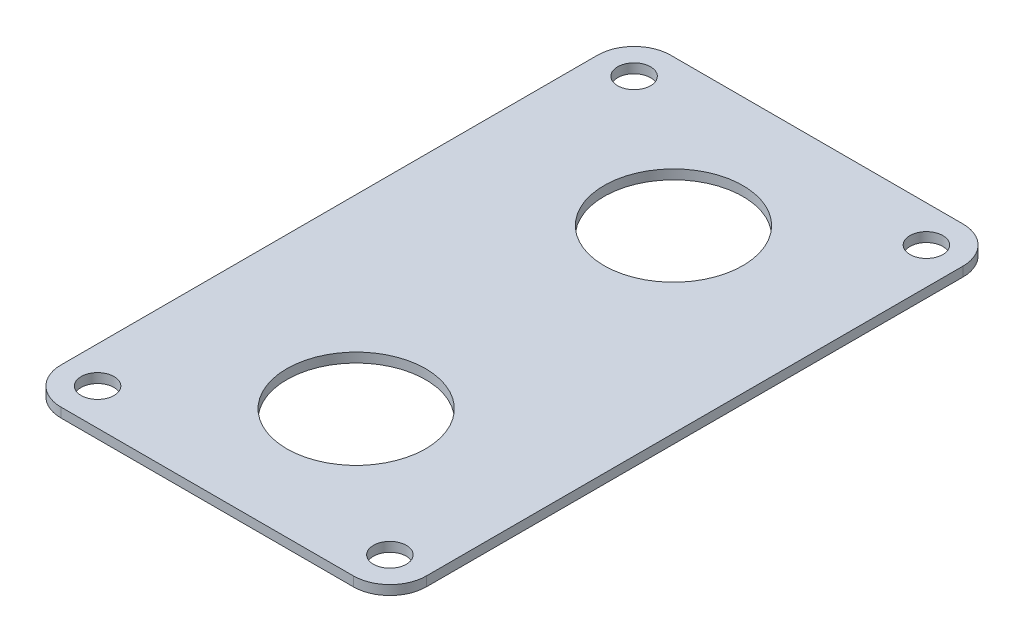
ISO-10303-21;
HEADER;
FILE_DESCRIPTION(('STEP AP214'),'2;1');
FILE_NAME('part.step','',(''),(''),'','','');
FILE_SCHEMA(('AUTOMOTIVE_DESIGN { 1 0 10303 214 1 1 1 1 }'));
ENDSEC;
DATA;
#1=APPLICATION_CONTEXT('core data for automotive mechanical design processes');
#2=APPLICATION_PROTOCOL_DEFINITION('international standard','automotive_design',2000,#1);
#3=PRODUCT_CONTEXT('',#1,'mechanical');
#4=PRODUCT('Part','Part','',(#3));
#5=PRODUCT_RELATED_PRODUCT_CATEGORY('part','',(#4));
#6=PRODUCT_DEFINITION_FORMATION('','',#4);
#7=PRODUCT_DEFINITION_CONTEXT('part definition',#1,'design');
#8=PRODUCT_DEFINITION('design','',#6,#7);
#9=PRODUCT_DEFINITION_SHAPE('','',#8);
#10=(LENGTH_UNIT() NAMED_UNIT(*) SI_UNIT(.MILLI.,.METRE.));
#11=(NAMED_UNIT(*) PLANE_ANGLE_UNIT() SI_UNIT($,.RADIAN.));
#12=(NAMED_UNIT(*) SI_UNIT($,.STERADIAN.) SOLID_ANGLE_UNIT());
#13=UNCERTAINTY_MEASURE_WITH_UNIT(LENGTH_MEASURE(1.E-05),#10,'distance_accuracy_value','');
#14=(GEOMETRIC_REPRESENTATION_CONTEXT(3) GLOBAL_UNCERTAINTY_ASSIGNED_CONTEXT((#13)) GLOBAL_UNIT_ASSIGNED_CONTEXT((#10,
#11,#12)) REPRESENTATION_CONTEXT('',''));
#15=CARTESIAN_POINT('',(0.,0.,0.));
#16=DIRECTION('',(0.,0.,1.));
#17=DIRECTION('',(1.,0.,0.));
#18=AXIS2_PLACEMENT_3D('',#15,#16,#17);
#19=CARTESIAN_POINT('',(24.6129365230756,-1.3,-41.9999999999941));
#20=DIRECTION('',(1.,0.,0.));
#21=DIRECTION('',(0.,0.,-1.));
#22=AXIS2_PLACEMENT_3D('',#19,#20,#21);
#23=PLANE('',#22);
#24=DIRECTION('',(0.,0.,-1.));
#25=VECTOR('',#24,1.);
#26=CARTESIAN_POINT('',(24.6129365230756,-1.3,-41.9999999999941));
#27=LINE('',#26,#25);
#28=CARTESIAN_POINT('',(24.6129365230756,-1.3,36.4143091811763));
#29=VERTEX_POINT('',#28);
#30=CARTESIAN_POINT('',(24.6129365230756,-1.3,-36.9999999999941));
#31=VERTEX_POINT('',#30);
#32=EDGE_CURVE('E170',#29,#31,#27,.T.);
#33=ORIENTED_EDGE('',*,*,#32,.T.);
#34=DIRECTION('',(0.,1.,0.));
#35=VECTOR('',#34,1.);
#36=CARTESIAN_POINT('',(24.6129365230756,-1.3,-36.9999999999941));
#37=LINE('',#36,#35);
#38=CARTESIAN_POINT('',(24.6129365230756,0.,-36.9999999999941));
#39=VERTEX_POINT('',#38);
#40=EDGE_CURVE('E117',#31,#39,#37,.T.);
#41=ORIENTED_EDGE('',*,*,#40,.T.);
#42=DIRECTION('',(0.,0.,-1.));
#43=VECTOR('',#42,1.);
#44=CARTESIAN_POINT('',(24.6129365230756,0.,-41.9999999999941));
#45=LINE('',#44,#43);
#46=CARTESIAN_POINT('',(24.6129365230756,0.,36.4143091811763));
#47=VERTEX_POINT('',#46);
#48=EDGE_CURVE('E109',#47,#39,#45,.T.);
#49=ORIENTED_EDGE('',*,*,#48,.F.);
#50=DIRECTION('',(0.,1.,0.));
#51=VECTOR('',#50,1.);
#52=CARTESIAN_POINT('',(24.6129365230756,-1.3,36.4143091811763));
#53=LINE('',#52,#51);
#54=EDGE_CURVE('E122',#47,#29,#53,.F.);
#55=ORIENTED_EDGE('',*,*,#54,.T.);
#56=EDGE_LOOP('',(#33,#41,#49,#55));
#57=FACE_BOUND('',#56,.T.);
#58=ADVANCED_FACE('F40',(#57),#23,.T.);
#59=CARTESIAN_POINT('',(-25.387063476925,-1.3,41.4143091811763));
#60=DIRECTION('',(0.,0.,1.));
#61=DIRECTION('',(1.,0.,0.));
#62=AXIS2_PLACEMENT_3D('',#59,#60,#61);
#63=PLANE('',#62);
#64=DIRECTION('',(1.,0.,0.));
#65=VECTOR('',#64,1.);
#66=CARTESIAN_POINT('',(-25.387063476925,0.,41.4143091811763));
#67=LINE('',#66,#65);
#68=CARTESIAN_POINT('',(-20.387063476925,0.,41.4143091811763));
#69=VERTEX_POINT('',#68);
#70=CARTESIAN_POINT('',(19.6129365230756,0.,41.4143091811763));
#71=VERTEX_POINT('',#70);
#72=EDGE_CURVE('E111',#69,#71,#67,.T.);
#73=ORIENTED_EDGE('',*,*,#72,.F.);
#74=DIRECTION('',(0.,1.,0.));
#75=VECTOR('',#74,1.);
#76=CARTESIAN_POINT('',(-20.387063476925,-1.3,41.4143091811763));
#77=LINE('',#76,#75);
#78=CARTESIAN_POINT('',(-20.387063476925,-1.3,41.4143091811763));
#79=VERTEX_POINT('',#78);
#80=EDGE_CURVE('E11',#69,#79,#77,.F.);
#81=ORIENTED_EDGE('',*,*,#80,.T.);
#82=DIRECTION('',(1.,0.,0.));
#83=VECTOR('',#82,1.);
#84=CARTESIAN_POINT('',(-25.387063476925,-1.3,41.4143091811763));
#85=LINE('',#84,#83);
#86=CARTESIAN_POINT('',(19.6129365230756,-1.3,41.4143091811763));
#87=VERTEX_POINT('',#86);
#88=EDGE_CURVE('E130',#79,#87,#85,.T.);
#89=ORIENTED_EDGE('',*,*,#88,.T.);
#90=DIRECTION('',(0.,1.,0.));
#91=VECTOR('',#90,1.);
#92=CARTESIAN_POINT('',(19.6129365230756,-1.3,41.4143091811763));
#93=LINE('',#92,#91);
#94=EDGE_CURVE('E48',#87,#71,#93,.T.);
#95=ORIENTED_EDGE('',*,*,#94,.T.);
#96=EDGE_LOOP('',(#73,#81,#89,#95));
#97=FACE_BOUND('',#96,.T.);
#98=ADVANCED_FACE('F159',(#97),#63,.T.);
#99=CARTESIAN_POINT('',(-25.387063476925,-1.3,-41.9999999999941));
#100=DIRECTION('',(-1.,0.,0.));
#101=DIRECTION('',(0.,0.,1.));
#102=AXIS2_PLACEMENT_3D('',#99,#100,#101);
#103=PLANE('',#102);
#104=DIRECTION('',(0.,0.,1.));
#105=VECTOR('',#104,1.);
#106=CARTESIAN_POINT('',(-25.387063476925,0.,-41.9999999999941));
#107=LINE('',#106,#105);
#108=CARTESIAN_POINT('',(-25.387063476925,0.,-36.9999999999941));
#109=VERTEX_POINT('',#108);
#110=CARTESIAN_POINT('',(-25.387063476925,0.,36.4143091811763));
#111=VERTEX_POINT('',#110);
#112=EDGE_CURVE('E168',#109,#111,#107,.T.);
#113=ORIENTED_EDGE('',*,*,#112,.F.);
#114=DIRECTION('',(0.,1.,0.));
#115=VECTOR('',#114,1.);
#116=CARTESIAN_POINT('',(-25.387063476925,-1.3,-36.9999999999941));
#117=LINE('',#116,#115);
#118=CARTESIAN_POINT('',(-25.387063476925,-1.3,-36.9999999999941));
#119=VERTEX_POINT('',#118);
#120=EDGE_CURVE('E62',#109,#119,#117,.F.);
#121=ORIENTED_EDGE('',*,*,#120,.T.);
#122=DIRECTION('',(0.,0.,1.));
#123=VECTOR('',#122,1.);
#124=CARTESIAN_POINT('',(-25.387063476925,-1.3,-41.9999999999941));
#125=LINE('',#124,#123);
#126=CARTESIAN_POINT('',(-25.387063476925,-1.3,36.4143091811763));
#127=VERTEX_POINT('',#126);
#128=EDGE_CURVE('E134',#119,#127,#125,.T.);
#129=ORIENTED_EDGE('',*,*,#128,.T.);
#130=DIRECTION('',(0.,1.,0.));
#131=VECTOR('',#130,1.);
#132=CARTESIAN_POINT('',(-25.387063476925,-1.3,36.4143091811763));
#133=LINE('',#132,#131);
#134=EDGE_CURVE('E155',#127,#111,#133,.T.);
#135=ORIENTED_EDGE('',*,*,#134,.T.);
#136=EDGE_LOOP('',(#113,#121,#129,#135));
#137=FACE_BOUND('',#136,.T.);
#138=ADVANCED_FACE('F167',(#137),#103,.T.);
#139=CARTESIAN_POINT('',(-25.387063476925,-1.3,-41.9999999999941));
#140=DIRECTION('',(0.,0.,-1.));
#141=DIRECTION('',(-1.,0.,0.));
#142=AXIS2_PLACEMENT_3D('',#139,#140,#141);
#143=PLANE('',#142);
#144=DIRECTION('',(-1.,0.,0.));
#145=VECTOR('',#144,1.);
#146=CARTESIAN_POINT('',(-25.387063476925,0.,-41.9999999999941));
#147=LINE('',#146,#145);
#148=CARTESIAN_POINT('',(19.6129365230756,0.,-41.9999999999941));
#149=VERTEX_POINT('',#148);
#150=CARTESIAN_POINT('',(-20.387063476925,0.,-41.9999999999941));
#151=VERTEX_POINT('',#150);
#152=EDGE_CURVE('E125',#149,#151,#147,.T.);
#153=ORIENTED_EDGE('',*,*,#152,.F.);
#154=DIRECTION('',(0.,1.,0.));
#155=VECTOR('',#154,1.);
#156=CARTESIAN_POINT('',(19.6129365230756,-1.3,-41.9999999999941));
#157=LINE('',#156,#155);
#158=CARTESIAN_POINT('',(19.6129365230756,-1.3,-41.9999999999941));
#159=VERTEX_POINT('',#158);
#160=EDGE_CURVE('E147',#149,#159,#157,.F.);
#161=ORIENTED_EDGE('',*,*,#160,.T.);
#162=DIRECTION('',(-1.,0.,0.));
#163=VECTOR('',#162,1.);
#164=CARTESIAN_POINT('',(-25.387063476925,-1.3,-41.9999999999941));
#165=LINE('',#164,#163);
#166=CARTESIAN_POINT('',(-20.387063476925,-1.3,-41.9999999999941));
#167=VERTEX_POINT('',#166);
#168=EDGE_CURVE('E174',#159,#167,#165,.T.);
#169=ORIENTED_EDGE('',*,*,#168,.T.);
#170=DIRECTION('',(0.,1.,0.));
#171=VECTOR('',#170,1.);
#172=CARTESIAN_POINT('',(-20.387063476925,-1.3,-41.9999999999941));
#173=LINE('',#172,#171);
#174=EDGE_CURVE('E144',#167,#151,#173,.T.);
#175=ORIENTED_EDGE('',*,*,#174,.T.);
#176=EDGE_LOOP('',(#153,#161,#169,#175));
#177=FACE_BOUND('',#176,.T.);
#178=ADVANCED_FACE('F239',(#177),#143,.T.);
#179=CARTESIAN_POINT('',(0.,-1.3,0.));
#180=DIRECTION('',(0.,1.,0.));
#181=DIRECTION('',(0.,0.,1.));
#182=AXIS2_PLACEMENT_3D('',#179,#180,#181);
#183=PLANE('',#182);
#184=CARTESIAN_POINT('',(19.6129365230812,-1.3,36.4143091811773));
#185=DIRECTION('',(0.,1.,0.));
#186=DIRECTION('',(0.,0.,1.));
#187=AXIS2_PLACEMENT_3D('',#184,#185,#186);
#188=CIRCLE('',#187,2.24999999999468);
#189=CARTESIAN_POINT('',(19.6129365230812,-1.3,38.664309181172));
#190=VERTEX_POINT('',#189);
#191=EDGE_CURVE('E207',#190,#190,#188,.T.);
#192=ORIENTED_EDGE('',*,*,#191,.T.);
#193=EDGE_LOOP('',(#192));
#194=FACE_BOUND('',#193,.T.);
#195=CARTESIAN_POINT('',(-20.3870634769188,-1.3,36.4143091811775));
#196=DIRECTION('',(0.,1.,0.));
#197=DIRECTION('',(0.,0.,1.));
#198=AXIS2_PLACEMENT_3D('',#195,#196,#197);
#199=CIRCLE('',#198,2.24999999999468);
#200=CARTESIAN_POINT('',(-20.3870634769188,-1.3,38.6643091811722));
#201=VERTEX_POINT('',#200);
#202=EDGE_CURVE('E201',#201,#201,#199,.T.);
#203=ORIENTED_EDGE('',*,*,#202,.T.);
#204=EDGE_LOOP('',(#203));
#205=FACE_BOUND('',#204,.T.);
#206=CARTESIAN_POINT('',(-20.3870634769192,-1.3,-36.9999999999927));
#207=DIRECTION('',(0.,1.,0.));
#208=DIRECTION('',(0.,0.,1.));
#209=AXIS2_PLACEMENT_3D('',#206,#207,#208);
#210=CIRCLE('',#209,2.24999999999468);
#211=CARTESIAN_POINT('',(-20.3870634769192,-1.3,-34.749999999998));
#212=VERTEX_POINT('',#211);
#213=EDGE_CURVE('E195',#212,#212,#210,.T.);
#214=ORIENTED_EDGE('',*,*,#213,.T.);
#215=EDGE_LOOP('',(#214));
#216=FACE_BOUND('',#215,.T.);
#217=CARTESIAN_POINT('',(19.6129365230808,-1.3,-36.9999999999929));
#218=DIRECTION('',(0.,1.,0.));
#219=DIRECTION('',(0.,0.,1.));
#220=AXIS2_PLACEMENT_3D('',#217,#218,#219);
#221=CIRCLE('',#220,2.24999999999468);
#222=CARTESIAN_POINT('',(19.6129365230808,-1.3,-34.7499999999982));
#223=VERTEX_POINT('',#222);
#224=EDGE_CURVE('E189',#223,#223,#221,.T.);
#225=ORIENTED_EDGE('',*,*,#224,.T.);
#226=EDGE_LOOP('',(#225));
#227=FACE_BOUND('',#226,.T.);
#228=CARTESIAN_POINT('',(0.,-1.3,21.4143091811822));
#229=DIRECTION('',(0.,1.,0.));
#230=DIRECTION('',(0.,0.,1.));
#231=AXIS2_PLACEMENT_3D('',#228,#229,#230);
#232=CIRCLE('',#231,9.50000000000235);
#233=CARTESIAN_POINT('',(0.,-1.3,30.9143091811845));
#234=VERTEX_POINT('',#233);
#235=EDGE_CURVE('E183',#234,#234,#232,.T.);
#236=ORIENTED_EDGE('',*,*,#235,.T.);
#237=EDGE_LOOP('',(#236));
#238=FACE_BOUND('',#237,.T.);
#239=CARTESIAN_POINT('',(0.,-1.3,-22.));
#240=DIRECTION('',(0.,1.,0.));
#241=DIRECTION('',(0.,0.,1.));
#242=AXIS2_PLACEMENT_3D('',#239,#240,#241);
#243=CIRCLE('',#242,9.5);
#244=CARTESIAN_POINT('',(0.,-1.3,-12.5));
#245=VERTEX_POINT('',#244);
#246=EDGE_CURVE('E126',#245,#245,#243,.T.);
#247=ORIENTED_EDGE('',*,*,#246,.T.);
#248=EDGE_LOOP('',(#247));
#249=FACE_BOUND('',#248,.T.);
#250=ORIENTED_EDGE('',*,*,#168,.F.);
#251=CARTESIAN_POINT('',(19.6129365230756,-1.3,-36.9999999999941));
#252=DIRECTION('',(0.,1.,0.));
#253=DIRECTION('',(0.,0.,1.));
#254=AXIS2_PLACEMENT_3D('',#251,#252,#253);
#255=CIRCLE('',#254,5.);
#256=EDGE_CURVE('E153',#159,#31,#255,.F.);
#257=ORIENTED_EDGE('',*,*,#256,.T.);
#258=ORIENTED_EDGE('',*,*,#32,.F.);
#259=CARTESIAN_POINT('',(19.6129365230756,-1.3,36.4143091811763));
#260=DIRECTION('',(0.,1.,0.));
#261=DIRECTION('',(0.,0.,1.));
#262=AXIS2_PLACEMENT_3D('',#259,#260,#261);
#263=CIRCLE('',#262,5.);
#264=EDGE_CURVE('E129',#29,#87,#263,.F.);
#265=ORIENTED_EDGE('',*,*,#264,.T.);
#266=ORIENTED_EDGE('',*,*,#88,.F.);
#267=CARTESIAN_POINT('',(-20.387063476925,-1.3,36.4143091811763));
#268=DIRECTION('',(0.,1.,0.));
#269=DIRECTION('',(0.,0.,1.));
#270=AXIS2_PLACEMENT_3D('',#267,#268,#269);
#271=CIRCLE('',#270,5.);
#272=EDGE_CURVE('E55',#79,#127,#271,.F.);
#273=ORIENTED_EDGE('',*,*,#272,.T.);
#274=ORIENTED_EDGE('',*,*,#128,.F.);
#275=CARTESIAN_POINT('',(-20.387063476925,-1.3,-36.9999999999941));
#276=DIRECTION('',(0.,1.,0.));
#277=DIRECTION('',(0.,0.,1.));
#278=AXIS2_PLACEMENT_3D('',#275,#276,#277);
#279=CIRCLE('',#278,5.);
#280=EDGE_CURVE('E151',#119,#167,#279,.F.);
#281=ORIENTED_EDGE('',*,*,#280,.T.);
#282=EDGE_LOOP('',(#250,#257,#258,#265,#266,#273,#274,#281));
#283=FACE_BOUND('',#282,.T.);
#284=ADVANCED_FACE('F162',(#194,#205,#216,#227,#238,#249,#283),#183,.F.);
#285=CARTESIAN_POINT('',(0.,0.,0.));
#286=DIRECTION('',(0.,1.,0.));
#287=DIRECTION('',(0.,0.,1.));
#288=AXIS2_PLACEMENT_3D('',#285,#286,#287);
#289=PLANE('',#288);
#290=CARTESIAN_POINT('',(19.6129365230812,0.,36.4143091811773));
#291=DIRECTION('',(0.,1.,0.));
#292=DIRECTION('',(0.,0.,1.));
#293=AXIS2_PLACEMENT_3D('',#290,#291,#292);
#294=CIRCLE('',#293,2.24999999999468);
#295=CARTESIAN_POINT('',(19.6129365230812,0.,38.664309181172));
#296=VERTEX_POINT('',#295);
#297=EDGE_CURVE('E210',#296,#296,#294,.T.);
#298=ORIENTED_EDGE('',*,*,#297,.F.);
#299=EDGE_LOOP('',(#298));
#300=FACE_BOUND('',#299,.T.);
#301=CARTESIAN_POINT('',(-20.3870634769188,0.,36.4143091811775));
#302=DIRECTION('',(0.,1.,0.));
#303=DIRECTION('',(0.,0.,1.));
#304=AXIS2_PLACEMENT_3D('',#301,#302,#303);
#305=CIRCLE('',#304,2.24999999999468);
#306=CARTESIAN_POINT('',(-20.3870634769188,0.,38.6643091811722));
#307=VERTEX_POINT('',#306);
#308=EDGE_CURVE('E204',#307,#307,#305,.T.);
#309=ORIENTED_EDGE('',*,*,#308,.F.);
#310=EDGE_LOOP('',(#309));
#311=FACE_BOUND('',#310,.T.);
#312=CARTESIAN_POINT('',(-20.3870634769192,0.,-36.9999999999927));
#313=DIRECTION('',(0.,1.,0.));
#314=DIRECTION('',(0.,0.,1.));
#315=AXIS2_PLACEMENT_3D('',#312,#313,#314);
#316=CIRCLE('',#315,2.24999999999468);
#317=CARTESIAN_POINT('',(-20.3870634769192,0.,-34.749999999998));
#318=VERTEX_POINT('',#317);
#319=EDGE_CURVE('E198',#318,#318,#316,.T.);
#320=ORIENTED_EDGE('',*,*,#319,.F.);
#321=EDGE_LOOP('',(#320));
#322=FACE_BOUND('',#321,.T.);
#323=CARTESIAN_POINT('',(19.6129365230808,0.,-36.9999999999929));
#324=DIRECTION('',(0.,1.,0.));
#325=DIRECTION('',(0.,0.,1.));
#326=AXIS2_PLACEMENT_3D('',#323,#324,#325);
#327=CIRCLE('',#326,2.24999999999468);
#328=CARTESIAN_POINT('',(19.6129365230808,0.,-34.7499999999982));
#329=VERTEX_POINT('',#328);
#330=EDGE_CURVE('E192',#329,#329,#327,.T.);
#331=ORIENTED_EDGE('',*,*,#330,.F.);
#332=EDGE_LOOP('',(#331));
#333=FACE_BOUND('',#332,.T.);
#334=CARTESIAN_POINT('',(0.,0.,21.4143091811822));
#335=DIRECTION('',(0.,1.,0.));
#336=DIRECTION('',(0.,0.,-1.));
#337=AXIS2_PLACEMENT_3D('',#334,#335,#336);
#338=CIRCLE('',#337,9.50000000000235);
#339=CARTESIAN_POINT('',(0.,0.,11.9143091811798));
#340=VERTEX_POINT('',#339);
#341=EDGE_CURVE('E186',#340,#340,#338,.T.);
#342=ORIENTED_EDGE('',*,*,#341,.F.);
#343=EDGE_LOOP('',(#342));
#344=FACE_BOUND('',#343,.T.);
#345=CARTESIAN_POINT('',(0.,0.,-22.));
#346=DIRECTION('',(0.,1.,0.));
#347=DIRECTION('',(0.,0.,1.));
#348=AXIS2_PLACEMENT_3D('',#345,#346,#347);
#349=CIRCLE('',#348,9.5);
#350=CARTESIAN_POINT('',(0.,0.,-12.5));
#351=VERTEX_POINT('',#350);
#352=EDGE_CURVE('E180',#351,#351,#349,.T.);
#353=ORIENTED_EDGE('',*,*,#352,.F.);
#354=EDGE_LOOP('',(#353));
#355=FACE_BOUND('',#354,.T.);
#356=ORIENTED_EDGE('',*,*,#48,.T.);
#357=CARTESIAN_POINT('',(19.6129365230756,0.,-36.9999999999941));
#358=DIRECTION('',(0.,1.,0.));
#359=DIRECTION('',(0.,0.,1.));
#360=AXIS2_PLACEMENT_3D('',#357,#358,#359);
#361=CIRCLE('',#360,5.);
#362=EDGE_CURVE('E142',#39,#149,#361,.T.);
#363=ORIENTED_EDGE('',*,*,#362,.T.);
#364=ORIENTED_EDGE('',*,*,#152,.T.);
#365=CARTESIAN_POINT('',(-20.387063476925,0.,-36.9999999999941));
#366=DIRECTION('',(0.,1.,0.));
#367=DIRECTION('',(0.,0.,1.));
#368=AXIS2_PLACEMENT_3D('',#365,#366,#367);
#369=CIRCLE('',#368,5.);
#370=EDGE_CURVE('E140',#151,#109,#369,.T.);
#371=ORIENTED_EDGE('',*,*,#370,.T.);
#372=ORIENTED_EDGE('',*,*,#112,.T.);
#373=CARTESIAN_POINT('',(-20.387063476925,0.,36.4143091811763));
#374=DIRECTION('',(0.,1.,0.));
#375=DIRECTION('',(0.,0.,1.));
#376=AXIS2_PLACEMENT_3D('',#373,#374,#375);
#377=CIRCLE('',#376,5.);
#378=EDGE_CURVE('E116',#111,#69,#377,.T.);
#379=ORIENTED_EDGE('',*,*,#378,.T.);
#380=ORIENTED_EDGE('',*,*,#72,.T.);
#381=CARTESIAN_POINT('',(19.6129365230756,0.,36.4143091811763));
#382=DIRECTION('',(0.,1.,0.));
#383=DIRECTION('',(0.,0.,1.));
#384=AXIS2_PLACEMENT_3D('',#381,#382,#383);
#385=CIRCLE('',#384,5.);
#386=EDGE_CURVE('E106',#71,#47,#385,.T.);
#387=ORIENTED_EDGE('',*,*,#386,.T.);
#388=EDGE_LOOP('',(#356,#363,#364,#371,#372,#379,#380,#387));
#389=FACE_BOUND('',#388,.T.);
#390=ADVANCED_FACE('F108',(#300,#311,#322,#333,#344,#355,#389),#289,.T.);
#391=CARTESIAN_POINT('',(19.6129365230756,-1.3,-36.9999999999941));
#392=DIRECTION('',(0.,1.,0.));
#393=DIRECTION('',(0.,0.,1.));
#394=AXIS2_PLACEMENT_3D('',#391,#392,#393);
#395=CYLINDRICAL_SURFACE('',#394,5.);
#396=ORIENTED_EDGE('',*,*,#256,.F.);
#397=ORIENTED_EDGE('',*,*,#160,.F.);
#398=ORIENTED_EDGE('',*,*,#362,.F.);
#399=ORIENTED_EDGE('',*,*,#40,.F.);
#400=EDGE_LOOP('',(#396,#397,#398,#399));
#401=FACE_BOUND('',#400,.T.);
#402=ADVANCED_FACE('F219',(#401),#395,.T.);
#403=CARTESIAN_POINT('',(-20.387063476925,-1.3,-36.9999999999941));
#404=DIRECTION('',(0.,1.,0.));
#405=DIRECTION('',(0.,0.,1.));
#406=AXIS2_PLACEMENT_3D('',#403,#404,#405);
#407=CYLINDRICAL_SURFACE('',#406,5.);
#408=ORIENTED_EDGE('',*,*,#280,.F.);
#409=ORIENTED_EDGE('',*,*,#120,.F.);
#410=ORIENTED_EDGE('',*,*,#370,.F.);
#411=ORIENTED_EDGE('',*,*,#174,.F.);
#412=EDGE_LOOP('',(#408,#409,#410,#411));
#413=FACE_BOUND('',#412,.T.);
#414=ADVANCED_FACE('F258',(#413),#407,.T.);
#415=CARTESIAN_POINT('',(-20.387063476925,-1.3,36.4143091811763));
#416=DIRECTION('',(0.,1.,0.));
#417=DIRECTION('',(0.,0.,1.));
#418=AXIS2_PLACEMENT_3D('',#415,#416,#417);
#419=CYLINDRICAL_SURFACE('',#418,5.);
#420=ORIENTED_EDGE('',*,*,#272,.F.);
#421=ORIENTED_EDGE('',*,*,#80,.F.);
#422=ORIENTED_EDGE('',*,*,#378,.F.);
#423=ORIENTED_EDGE('',*,*,#134,.F.);
#424=EDGE_LOOP('',(#420,#421,#422,#423));
#425=FACE_BOUND('',#424,.T.);
#426=ADVANCED_FACE('F165',(#425),#419,.T.);
#427=CARTESIAN_POINT('',(19.6129365230756,-1.3,36.4143091811763));
#428=DIRECTION('',(0.,1.,0.));
#429=DIRECTION('',(0.,0.,1.));
#430=AXIS2_PLACEMENT_3D('',#427,#428,#429);
#431=CYLINDRICAL_SURFACE('',#430,5.);
#432=ORIENTED_EDGE('',*,*,#264,.F.);
#433=ORIENTED_EDGE('',*,*,#54,.F.);
#434=ORIENTED_EDGE('',*,*,#386,.F.);
#435=ORIENTED_EDGE('',*,*,#94,.F.);
#436=EDGE_LOOP('',(#432,#433,#434,#435));
#437=FACE_BOUND('',#436,.T.);
#438=ADVANCED_FACE('F42',(#437),#431,.T.);
#439=CARTESIAN_POINT('',(0.,-10.,-22.));
#440=DIRECTION('',(0.,1.,0.));
#441=DIRECTION('',(0.,0.,1.));
#442=AXIS2_PLACEMENT_3D('',#439,#440,#441);
#443=CYLINDRICAL_SURFACE('',#442,9.5);
#444=ORIENTED_EDGE('',*,*,#352,.T.);
#445=EDGE_LOOP('',(#444));
#446=FACE_BOUND('',#445,.T.);
#447=ORIENTED_EDGE('',*,*,#246,.F.);
#448=EDGE_LOOP('',(#447));
#449=FACE_BOUND('',#448,.T.);
#450=ADVANCED_FACE('F231',(#446,#449),#443,.F.);
#451=CARTESIAN_POINT('',(0.,-10.,21.4143091811822));
#452=DIRECTION('',(0.,1.,0.));
#453=DIRECTION('',(0.,0.,1.));
#454=AXIS2_PLACEMENT_3D('',#451,#452,#453);
#455=CYLINDRICAL_SURFACE('',#454,9.50000000000235);
#456=ORIENTED_EDGE('',*,*,#341,.T.);
#457=EDGE_LOOP('',(#456));
#458=FACE_BOUND('',#457,.T.);
#459=ORIENTED_EDGE('',*,*,#235,.F.);
#460=EDGE_LOOP('',(#459));
#461=FACE_BOUND('',#460,.T.);
#462=ADVANCED_FACE('F234',(#458,#461),#455,.F.);
#463=CARTESIAN_POINT('',(19.6129365230808,-10.,-36.9999999999929));
#464=DIRECTION('',(0.,1.,0.));
#465=DIRECTION('',(0.,0.,1.));
#466=AXIS2_PLACEMENT_3D('',#463,#464,#465);
#467=CYLINDRICAL_SURFACE('',#466,2.24999999999468);
#468=ORIENTED_EDGE('',*,*,#330,.T.);
#469=EDGE_LOOP('',(#468));
#470=FACE_BOUND('',#469,.T.);
#471=ORIENTED_EDGE('',*,*,#224,.F.);
#472=EDGE_LOOP('',(#471));
#473=FACE_BOUND('',#472,.T.);
#474=ADVANCED_FACE('F278',(#470,#473),#467,.F.);
#475=CARTESIAN_POINT('',(-20.3870634769192,-10.,-36.9999999999927));
#476=DIRECTION('',(0.,1.,0.));
#477=DIRECTION('',(0.,0.,1.));
#478=AXIS2_PLACEMENT_3D('',#475,#476,#477);
#479=CYLINDRICAL_SURFACE('',#478,2.24999999999468);
#480=ORIENTED_EDGE('',*,*,#319,.T.);
#481=EDGE_LOOP('',(#480));
#482=FACE_BOUND('',#481,.T.);
#483=ORIENTED_EDGE('',*,*,#213,.F.);
#484=EDGE_LOOP('',(#483));
#485=FACE_BOUND('',#484,.T.);
#486=ADVANCED_FACE('F286',(#482,#485),#479,.F.);
#487=CARTESIAN_POINT('',(-20.3870634769188,-10.,36.4143091811775));
#488=DIRECTION('',(0.,1.,0.));
#489=DIRECTION('',(0.,0.,1.));
#490=AXIS2_PLACEMENT_3D('',#487,#488,#489);
#491=CYLINDRICAL_SURFACE('',#490,2.24999999999468);
#492=ORIENTED_EDGE('',*,*,#308,.T.);
#493=EDGE_LOOP('',(#492));
#494=FACE_BOUND('',#493,.T.);
#495=ORIENTED_EDGE('',*,*,#202,.F.);
#496=EDGE_LOOP('',(#495));
#497=FACE_BOUND('',#496,.T.);
#498=ADVANCED_FACE('F295',(#494,#497),#491,.F.);
#499=CARTESIAN_POINT('',(19.6129365230812,-10.,36.4143091811773));
#500=DIRECTION('',(0.,1.,0.));
#501=DIRECTION('',(0.,0.,1.));
#502=AXIS2_PLACEMENT_3D('',#499,#500,#501);
#503=CYLINDRICAL_SURFACE('',#502,2.24999999999468);
#504=ORIENTED_EDGE('',*,*,#297,.T.);
#505=EDGE_LOOP('',(#504));
#506=FACE_BOUND('',#505,.T.);
#507=ORIENTED_EDGE('',*,*,#191,.F.);
#508=EDGE_LOOP('',(#507));
#509=FACE_BOUND('',#508,.T.);
#510=ADVANCED_FACE('F214',(#506,#509),#503,.F.);
#511=CLOSED_SHELL('',(#58,#98,#138,#178,#284,#390,#402,#414,#426,#438,#450,#462,#474,#486,#498,#510));
#512=MANIFOLD_SOLID_BREP('B2',#511);
#513=ADVANCED_BREP_SHAPE_REPRESENTATION('',(#18,#512),#14);
#514=SHAPE_DEFINITION_REPRESENTATION(#9,#513);
ENDSEC;
END-ISO-10303-21;
